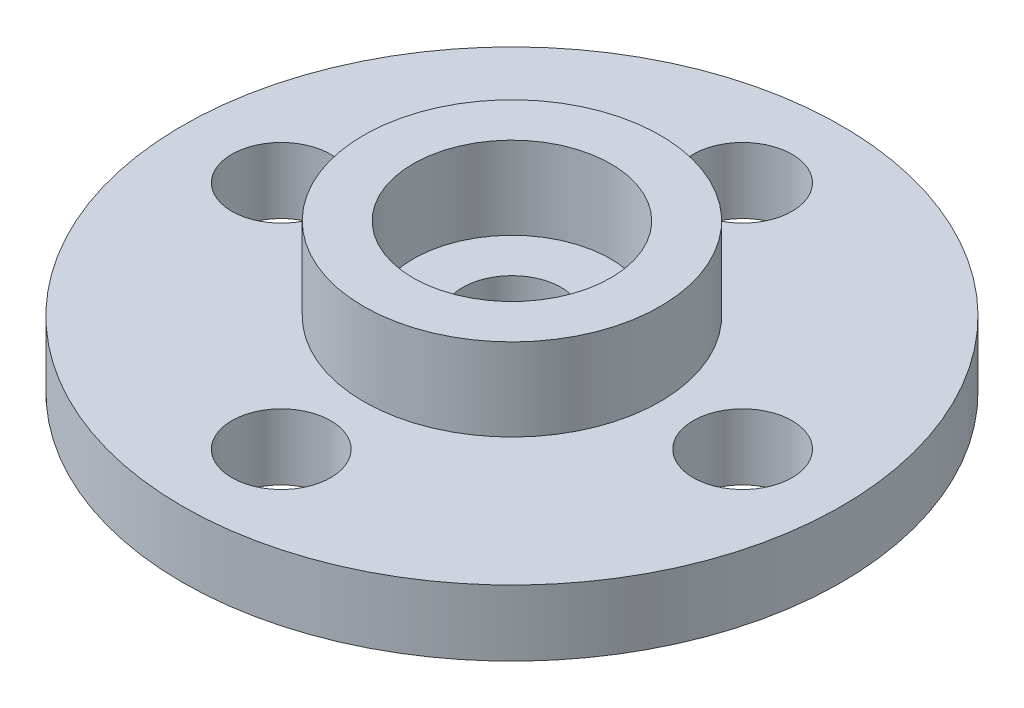
ISO-10303-21;
HEADER;
FILE_DESCRIPTION(('STEP AP214'),'2;1');
FILE_NAME('part.step','',(''),(''),'','','');
FILE_SCHEMA(('AUTOMOTIVE_DESIGN { 1 0 10303 214 1 1 1 1 }'));
ENDSEC;
DATA;
#1=APPLICATION_CONTEXT('core data for automotive mechanical design processes');
#2=APPLICATION_PROTOCOL_DEFINITION('international standard','automotive_design',2000,#1);
#3=PRODUCT_CONTEXT('',#1,'mechanical');
#4=PRODUCT('Part','Part','',(#3));
#5=PRODUCT_RELATED_PRODUCT_CATEGORY('part','',(#4));
#6=PRODUCT_DEFINITION_FORMATION('','',#4);
#7=PRODUCT_DEFINITION_CONTEXT('part definition',#1,'design');
#8=PRODUCT_DEFINITION('design','',#6,#7);
#9=PRODUCT_DEFINITION_SHAPE('','',#8);
#10=(LENGTH_UNIT() NAMED_UNIT(*) SI_UNIT(.MILLI.,.METRE.));
#11=(NAMED_UNIT(*) PLANE_ANGLE_UNIT() SI_UNIT($,.RADIAN.));
#12=(NAMED_UNIT(*) SI_UNIT($,.STERADIAN.) SOLID_ANGLE_UNIT());
#13=UNCERTAINTY_MEASURE_WITH_UNIT(LENGTH_MEASURE(1.E-05),#10,'distance_accuracy_value','');
#14=(GEOMETRIC_REPRESENTATION_CONTEXT(3) GLOBAL_UNCERTAINTY_ASSIGNED_CONTEXT((#13)) GLOBAL_UNIT_ASSIGNED_CONTEXT((#10,
#11,#12)) REPRESENTATION_CONTEXT('',''));
#15=CARTESIAN_POINT('',(0.,0.,0.));
#16=DIRECTION('',(0.,0.,1.));
#17=DIRECTION('',(1.,0.,0.));
#18=AXIS2_PLACEMENT_3D('',#15,#16,#17);
#19=CARTESIAN_POINT('',(0.,2.,0.));
#20=DIRECTION('',(0.,1.,0.));
#21=DIRECTION('',(0.,0.,1.));
#22=AXIS2_PLACEMENT_3D('',#19,#20,#21);
#23=PLANE('',#22);
#24=CARTESIAN_POINT('',(0.,2.,0.));
#25=DIRECTION('',(0.,1.,0.));
#26=DIRECTION('',(0.,0.,1.));
#27=AXIS2_PLACEMENT_3D('',#24,#25,#26);
#28=CIRCLE('',#27,1.5);
#29=CARTESIAN_POINT('',(0.,2.,1.5));
#30=VERTEX_POINT('',#29);
#31=EDGE_CURVE('E52',#30,#30,#28,.T.);
#32=ORIENTED_EDGE('',*,*,#31,.F.);
#33=EDGE_LOOP('',(#32));
#34=FACE_BOUND('',#33,.T.);
#35=CARTESIAN_POINT('',(0.,2.,0.));
#36=DIRECTION('',(0.,1.,0.));
#37=DIRECTION('',(0.,0.,1.));
#38=AXIS2_PLACEMENT_3D('',#35,#36,#37);
#39=CIRCLE('',#38,3.);
#40=CARTESIAN_POINT('',(0.,2.,3.));
#41=VERTEX_POINT('',#40);
#42=EDGE_CURVE('E10',#41,#41,#39,.F.);
#43=ORIENTED_EDGE('',*,*,#42,.F.);
#44=EDGE_LOOP('',(#43));
#45=FACE_BOUND('',#44,.T.);
#46=ADVANCED_FACE('F31',(#34,#45),#23,.T.);
#47=CARTESIAN_POINT('',(0.,2.,0.));
#48=DIRECTION('',(0.,1.,0.));
#49=DIRECTION('',(0.,0.,1.));
#50=AXIS2_PLACEMENT_3D('',#47,#48,#49);
#51=CIRCLE('',#50,4.5);
#52=CARTESIAN_POINT('',(0.,2.,4.5));
#53=VERTEX_POINT('',#52);
#54=EDGE_CURVE('E79',#53,#53,#51,.T.);
#55=ORIENTED_EDGE('',*,*,#54,.F.);
#56=EDGE_LOOP('',(#55));
#57=FACE_BOUND('',#56,.T.);
#58=CARTESIAN_POINT('',(0.,2.,-7.));
#59=DIRECTION('',(0.,1.,0.));
#60=DIRECTION('',(0.,0.,1.));
#61=AXIS2_PLACEMENT_3D('',#58,#59,#60);
#62=CIRCLE('',#61,1.5);
#63=CARTESIAN_POINT('',(0.,2.,-5.5));
#64=VERTEX_POINT('',#63);
#65=EDGE_CURVE('E64',#64,#64,#62,.T.);
#66=ORIENTED_EDGE('',*,*,#65,.F.);
#67=EDGE_LOOP('',(#66));
#68=FACE_BOUND('',#67,.T.);
#69=CARTESIAN_POINT('',(0.,2.,0.));
#70=DIRECTION('',(0.,1.,0.));
#71=DIRECTION('',(0.,0.,1.));
#72=AXIS2_PLACEMENT_3D('',#69,#70,#71);
#73=CIRCLE('',#72,10.);
#74=CARTESIAN_POINT('',(0.,2.,10.));
#75=VERTEX_POINT('',#74);
#76=EDGE_CURVE('E38',#75,#75,#73,.T.);
#77=ORIENTED_EDGE('',*,*,#76,.T.);
#78=EDGE_LOOP('',(#77));
#79=FACE_BOUND('',#78,.T.);
#80=CARTESIAN_POINT('',(0.,2.,7.));
#81=DIRECTION('',(0.,1.,0.));
#82=DIRECTION('',(0.,0.,1.));
#83=AXIS2_PLACEMENT_3D('',#80,#81,#82);
#84=CIRCLE('',#83,1.5);
#85=CARTESIAN_POINT('',(0.,2.,8.5));
#86=VERTEX_POINT('',#85);
#87=EDGE_CURVE('E47',#86,#86,#84,.T.);
#88=ORIENTED_EDGE('',*,*,#87,.F.);
#89=EDGE_LOOP('',(#88));
#90=FACE_BOUND('',#89,.T.);
#91=CARTESIAN_POINT('',(-7.,2.,0.));
#92=DIRECTION('',(0.,1.,0.));
#93=DIRECTION('',(0.,0.,1.));
#94=AXIS2_PLACEMENT_3D('',#91,#92,#93);
#95=CIRCLE('',#94,1.5);
#96=CARTESIAN_POINT('',(-7.,2.,1.5));
#97=VERTEX_POINT('',#96);
#98=EDGE_CURVE('E58',#97,#97,#95,.T.);
#99=ORIENTED_EDGE('',*,*,#98,.F.);
#100=EDGE_LOOP('',(#99));
#101=FACE_BOUND('',#100,.T.);
#102=CARTESIAN_POINT('',(7.,2.,0.));
#103=DIRECTION('',(0.,1.,0.));
#104=DIRECTION('',(0.,0.,1.));
#105=AXIS2_PLACEMENT_3D('',#102,#103,#104);
#106=CIRCLE('',#105,1.5);
#107=CARTESIAN_POINT('',(7.,2.,1.5));
#108=VERTEX_POINT('',#107);
#109=EDGE_CURVE('E70',#108,#108,#106,.T.);
#110=ORIENTED_EDGE('',*,*,#109,.F.);
#111=EDGE_LOOP('',(#110));
#112=FACE_BOUND('',#111,.T.);
#113=ADVANCED_FACE('F107',(#57,#68,#79,#90,#101,#112),#23,.T.);
#114=CARTESIAN_POINT('',(0.,0.,0.));
#115=DIRECTION('',(0.,1.,0.));
#116=DIRECTION('',(0.,0.,1.));
#117=AXIS2_PLACEMENT_3D('',#114,#115,#116);
#118=PLANE('',#117);
#119=CARTESIAN_POINT('',(0.,0.,0.));
#120=DIRECTION('',(0.,1.,0.));
#121=DIRECTION('',(0.,0.,1.));
#122=AXIS2_PLACEMENT_3D('',#119,#120,#121);
#123=CIRCLE('',#122,10.);
#124=CARTESIAN_POINT('',(0.,0.,10.));
#125=VERTEX_POINT('',#124);
#126=EDGE_CURVE('E42',#125,#125,#123,.T.);
#127=ORIENTED_EDGE('',*,*,#126,.F.);
#128=EDGE_LOOP('',(#127));
#129=FACE_BOUND('',#128,.T.);
#130=CARTESIAN_POINT('',(0.,0.,7.));
#131=DIRECTION('',(0.,1.,0.));
#132=DIRECTION('',(0.,0.,1.));
#133=AXIS2_PLACEMENT_3D('',#130,#131,#132);
#134=CIRCLE('',#133,1.5);
#135=CARTESIAN_POINT('',(0.,0.,8.5));
#136=VERTEX_POINT('',#135);
#137=EDGE_CURVE('E49',#136,#136,#134,.T.);
#138=ORIENTED_EDGE('',*,*,#137,.T.);
#139=EDGE_LOOP('',(#138));
#140=FACE_BOUND('',#139,.T.);
#141=CARTESIAN_POINT('',(0.,0.,0.));
#142=DIRECTION('',(0.,1.,0.));
#143=DIRECTION('',(0.,0.,1.));
#144=AXIS2_PLACEMENT_3D('',#141,#142,#143);
#145=CIRCLE('',#144,1.5);
#146=CARTESIAN_POINT('',(0.,0.,1.5));
#147=VERTEX_POINT('',#146);
#148=EDGE_CURVE('E55',#147,#147,#145,.T.);
#149=ORIENTED_EDGE('',*,*,#148,.T.);
#150=EDGE_LOOP('',(#149));
#151=FACE_BOUND('',#150,.T.);
#152=CARTESIAN_POINT('',(-7.,0.,0.));
#153=DIRECTION('',(0.,1.,0.));
#154=DIRECTION('',(0.,0.,1.));
#155=AXIS2_PLACEMENT_3D('',#152,#153,#154);
#156=CIRCLE('',#155,1.5);
#157=CARTESIAN_POINT('',(-7.,0.,1.5));
#158=VERTEX_POINT('',#157);
#159=EDGE_CURVE('E61',#158,#158,#156,.T.);
#160=ORIENTED_EDGE('',*,*,#159,.T.);
#161=EDGE_LOOP('',(#160));
#162=FACE_BOUND('',#161,.T.);
#163=CARTESIAN_POINT('',(0.,0.,-7.));
#164=DIRECTION('',(0.,1.,0.));
#165=DIRECTION('',(0.,0.,1.));
#166=AXIS2_PLACEMENT_3D('',#163,#164,#165);
#167=CIRCLE('',#166,1.5);
#168=CARTESIAN_POINT('',(0.,0.,-5.5));
#169=VERTEX_POINT('',#168);
#170=EDGE_CURVE('E67',#169,#169,#167,.T.);
#171=ORIENTED_EDGE('',*,*,#170,.T.);
#172=EDGE_LOOP('',(#171));
#173=FACE_BOUND('',#172,.T.);
#174=CARTESIAN_POINT('',(7.,0.,0.));
#175=DIRECTION('',(0.,1.,0.));
#176=DIRECTION('',(0.,0.,1.));
#177=AXIS2_PLACEMENT_3D('',#174,#175,#176);
#178=CIRCLE('',#177,1.5);
#179=CARTESIAN_POINT('',(7.,0.,1.5));
#180=VERTEX_POINT('',#179);
#181=EDGE_CURVE('E73',#180,#180,#178,.T.);
#182=ORIENTED_EDGE('',*,*,#181,.T.);
#183=EDGE_LOOP('',(#182));
#184=FACE_BOUND('',#183,.T.);
#185=ADVANCED_FACE('F113',(#129,#140,#151,#162,#173,#184),#118,.F.);
#186=CARTESIAN_POINT('',(0.,2.,0.));
#187=DIRECTION('',(0.,-1.,0.));
#188=DIRECTION('',(0.,0.,-1.));
#189=AXIS2_PLACEMENT_3D('',#186,#187,#188);
#190=CYLINDRICAL_SURFACE('',#189,10.);
#191=ORIENTED_EDGE('',*,*,#76,.F.);
#192=EDGE_LOOP('',(#191));
#193=FACE_BOUND('',#192,.T.);
#194=ORIENTED_EDGE('',*,*,#126,.T.);
#195=EDGE_LOOP('',(#194));
#196=FACE_BOUND('',#195,.T.);
#197=ADVANCED_FACE('F33',(#193,#196),#190,.T.);
#198=CARTESIAN_POINT('',(0.,2.,7.));
#199=DIRECTION('',(0.,-1.,0.));
#200=DIRECTION('',(0.,0.,-1.));
#201=AXIS2_PLACEMENT_3D('',#198,#199,#200);
#202=CYLINDRICAL_SURFACE('',#201,1.5);
#203=ORIENTED_EDGE('',*,*,#87,.T.);
#204=EDGE_LOOP('',(#203));
#205=FACE_BOUND('',#204,.T.);
#206=ORIENTED_EDGE('',*,*,#137,.F.);
#207=EDGE_LOOP('',(#206));
#208=FACE_BOUND('',#207,.T.);
#209=ADVANCED_FACE('F118',(#205,#208),#202,.F.);
#210=CARTESIAN_POINT('',(0.,2.,0.));
#211=DIRECTION('',(0.,-1.,0.));
#212=DIRECTION('',(0.,0.,-1.));
#213=AXIS2_PLACEMENT_3D('',#210,#211,#212);
#214=CYLINDRICAL_SURFACE('',#213,1.5);
#215=ORIENTED_EDGE('',*,*,#31,.T.);
#216=EDGE_LOOP('',(#215));
#217=FACE_BOUND('',#216,.T.);
#218=ORIENTED_EDGE('',*,*,#148,.F.);
#219=EDGE_LOOP('',(#218));
#220=FACE_BOUND('',#219,.T.);
#221=ADVANCED_FACE('F146',(#217,#220),#214,.F.);
#222=CARTESIAN_POINT('',(-7.,2.,0.));
#223=DIRECTION('',(0.,-1.,0.));
#224=DIRECTION('',(0.,0.,-1.));
#225=AXIS2_PLACEMENT_3D('',#222,#223,#224);
#226=CYLINDRICAL_SURFACE('',#225,1.5);
#227=ORIENTED_EDGE('',*,*,#98,.T.);
#228=EDGE_LOOP('',(#227));
#229=FACE_BOUND('',#228,.T.);
#230=ORIENTED_EDGE('',*,*,#159,.F.);
#231=EDGE_LOOP('',(#230));
#232=FACE_BOUND('',#231,.T.);
#233=ADVANCED_FACE('F140',(#229,#232),#226,.F.);
#234=CARTESIAN_POINT('',(0.,2.,-7.));
#235=DIRECTION('',(0.,-1.,0.));
#236=DIRECTION('',(0.,0.,-1.));
#237=AXIS2_PLACEMENT_3D('',#234,#235,#236);
#238=CYLINDRICAL_SURFACE('',#237,1.5);
#239=ORIENTED_EDGE('',*,*,#65,.T.);
#240=EDGE_LOOP('',(#239));
#241=FACE_BOUND('',#240,.T.);
#242=ORIENTED_EDGE('',*,*,#170,.F.);
#243=EDGE_LOOP('',(#242));
#244=FACE_BOUND('',#243,.T.);
#245=ADVANCED_FACE('F102',(#241,#244),#238,.F.);
#246=CARTESIAN_POINT('',(7.,2.,0.));
#247=DIRECTION('',(0.,-1.,0.));
#248=DIRECTION('',(0.,0.,-1.));
#249=AXIS2_PLACEMENT_3D('',#246,#247,#248);
#250=CYLINDRICAL_SURFACE('',#249,1.5);
#251=ORIENTED_EDGE('',*,*,#109,.T.);
#252=EDGE_LOOP('',(#251));
#253=FACE_BOUND('',#252,.T.);
#254=ORIENTED_EDGE('',*,*,#181,.F.);
#255=EDGE_LOOP('',(#254));
#256=FACE_BOUND('',#255,.T.);
#257=ADVANCED_FACE('F93',(#253,#256),#250,.F.);
#258=CARTESIAN_POINT('',(0.,4.5,0.));
#259=DIRECTION('',(0.,1.,0.));
#260=DIRECTION('',(0.,0.,1.));
#261=AXIS2_PLACEMENT_3D('',#258,#259,#260);
#262=PLANE('',#261);
#263=CARTESIAN_POINT('',(0.,4.5,0.));
#264=DIRECTION('',(0.,1.,0.));
#265=DIRECTION('',(0.,0.,1.));
#266=AXIS2_PLACEMENT_3D('',#263,#264,#265);
#267=CIRCLE('',#266,4.5);
#268=CARTESIAN_POINT('',(0.,4.5,4.5));
#269=VERTEX_POINT('',#268);
#270=EDGE_CURVE('E76',#269,#269,#267,.T.);
#271=ORIENTED_EDGE('',*,*,#270,.T.);
#272=EDGE_LOOP('',(#271));
#273=FACE_BOUND('',#272,.T.);
#274=CARTESIAN_POINT('',(0.,4.5,0.));
#275=DIRECTION('',(0.,1.,0.));
#276=DIRECTION('',(0.,0.,1.));
#277=AXIS2_PLACEMENT_3D('',#274,#275,#276);
#278=CIRCLE('',#277,3.);
#279=CARTESIAN_POINT('',(0.,4.5,3.));
#280=VERTEX_POINT('',#279);
#281=EDGE_CURVE('E82',#280,#280,#278,.T.);
#282=ORIENTED_EDGE('',*,*,#281,.F.);
#283=EDGE_LOOP('',(#282));
#284=FACE_BOUND('',#283,.T.);
#285=ADVANCED_FACE('F90',(#273,#284),#262,.T.);
#286=CARTESIAN_POINT('',(0.,4.5,0.));
#287=DIRECTION('',(0.,-1.,0.));
#288=DIRECTION('',(0.,0.,-1.));
#289=AXIS2_PLACEMENT_3D('',#286,#287,#288);
#290=CYLINDRICAL_SURFACE('',#289,4.5);
#291=ORIENTED_EDGE('',*,*,#270,.F.);
#292=EDGE_LOOP('',(#291));
#293=FACE_BOUND('',#292,.T.);
#294=ORIENTED_EDGE('',*,*,#54,.T.);
#295=EDGE_LOOP('',(#294));
#296=FACE_BOUND('',#295,.T.);
#297=ADVANCED_FACE('F92',(#293,#296),#290,.T.);
#298=CARTESIAN_POINT('',(0.,4.5,0.));
#299=DIRECTION('',(0.,-1.,0.));
#300=DIRECTION('',(0.,0.,-1.));
#301=AXIS2_PLACEMENT_3D('',#298,#299,#300);
#302=CYLINDRICAL_SURFACE('',#301,3.);
#303=ORIENTED_EDGE('',*,*,#281,.T.);
#304=EDGE_LOOP('',(#303));
#305=FACE_BOUND('',#304,.T.);
#306=ORIENTED_EDGE('',*,*,#42,.T.);
#307=EDGE_LOOP('',(#306));
#308=FACE_BOUND('',#307,.T.);
#309=ADVANCED_FACE('F88',(#305,#308),#302,.F.);
#310=CLOSED_SHELL('',(#46,#113,#185,#197,#209,#221,#233,#245,#257,#285,#297,#309));
#311=MANIFOLD_SOLID_BREP('B2',#310);
#312=ADVANCED_BREP_SHAPE_REPRESENTATION('',(#18,#311),#14);
#313=SHAPE_DEFINITION_REPRESENTATION(#9,#312);
ENDSEC;
END-ISO-10303-21;
